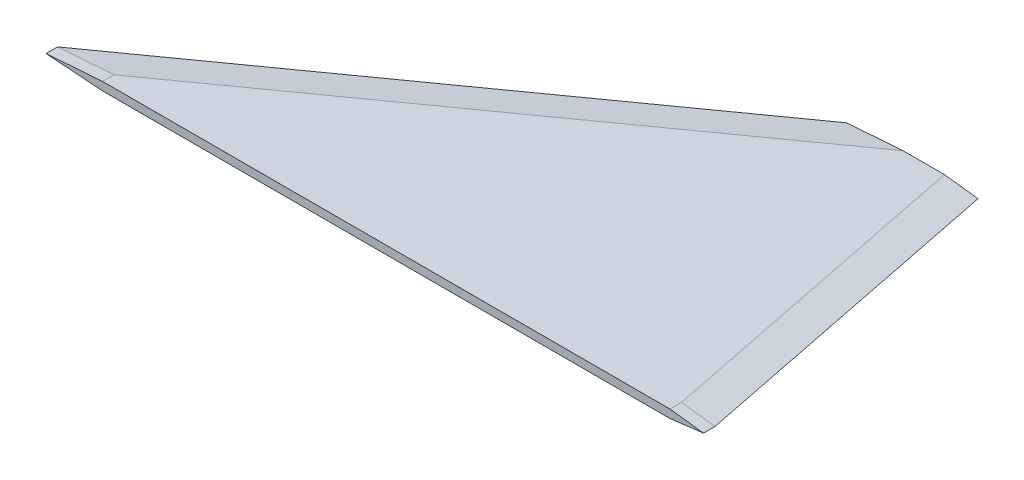
ISO-10303-21;
HEADER;
FILE_DESCRIPTION(('STEP AP214'),'2;1');
FILE_NAME('part.step','',(''),(''),'','','');
FILE_SCHEMA(('AUTOMOTIVE_DESIGN { 1 0 10303 214 1 1 1 1 }'));
ENDSEC;
DATA;
#1=APPLICATION_CONTEXT('core data for automotive mechanical design processes');
#2=APPLICATION_PROTOCOL_DEFINITION('international standard','automotive_design',2000,#1);
#3=PRODUCT_CONTEXT('',#1,'mechanical');
#4=PRODUCT('Part','Part','',(#3));
#5=PRODUCT_RELATED_PRODUCT_CATEGORY('part','',(#4));
#6=PRODUCT_DEFINITION_FORMATION('','',#4);
#7=PRODUCT_DEFINITION_CONTEXT('part definition',#1,'design');
#8=PRODUCT_DEFINITION('design','',#6,#7);
#9=PRODUCT_DEFINITION_SHAPE('','',#8);
#10=(LENGTH_UNIT() NAMED_UNIT(*) SI_UNIT(.MILLI.,.METRE.));
#11=(NAMED_UNIT(*) PLANE_ANGLE_UNIT() SI_UNIT($,.RADIAN.));
#12=(NAMED_UNIT(*) SI_UNIT($,.STERADIAN.) SOLID_ANGLE_UNIT());
#13=UNCERTAINTY_MEASURE_WITH_UNIT(LENGTH_MEASURE(1.E-05),#10,'distance_accuracy_value','');
#14=(GEOMETRIC_REPRESENTATION_CONTEXT(3) GLOBAL_UNCERTAINTY_ASSIGNED_CONTEXT((#13)) GLOBAL_UNIT_ASSIGNED_CONTEXT((#10,
#11,#12)) REPRESENTATION_CONTEXT('',''));
#15=CARTESIAN_POINT('',(0.,0.,0.));
#16=DIRECTION('',(0.,0.,1.));
#17=DIRECTION('',(1.,0.,0.));
#18=AXIS2_PLACEMENT_3D('',#15,#16,#17);
#19=CARTESIAN_POINT('',(50.8,1.5875,-127.));
#20=DIRECTION('',(0.,0.,1.));
#21=DIRECTION('',(1.,0.,0.));
#22=AXIS2_PLACEMENT_3D('',#19,#20,#21);
#23=PLANE('',#22);
#24=DIRECTION('',(-1.,0.,0.));
#25=VECTOR('',#24,1.);
#26=CARTESIAN_POINT('',(50.8,1.5875,-127.));
#27=LINE('',#26,#25);
#28=CARTESIAN_POINT('',(88.6484904354742,1.5875,-127.));
#29=VERTEX_POINT('',#28);
#30=CARTESIAN_POINT('',(72.6499061782882,1.5875,-127.));
#31=VERTEX_POINT('',#30);
#32=EDGE_CURVE('E135',#29,#31,#27,.T.);
#33=ORIENTED_EDGE('',*,*,#32,.F.);
#34=DIRECTION('',(-0.992571580398274,0.121662063872318,0.));
#35=VECTOR('',#34,1.);
#36=CARTESIAN_POINT('',(109.350975108138,-0.950057051100235,-127.));
#37=LINE('',#36,#35);
#38=CARTESIAN_POINT('',(101.6,0.,-127.));
#39=VERTEX_POINT('',#38);
#40=EDGE_CURVE('E159',#29,#39,#37,.F.);
#41=ORIENTED_EDGE('',*,*,#40,.T.);
#42=DIRECTION('',(-0.992571580398275,-0.121662063872315,0.));
#43=VECTOR('',#42,1.);
#44=CARTESIAN_POINT('',(101.6,0.,-127.));
#45=LINE('',#44,#43);
#46=CARTESIAN_POINT('',(88.6484904354738,-1.5875,-127.));
#47=VERTEX_POINT('',#46);
#48=EDGE_CURVE('E56',#39,#47,#45,.T.);
#49=ORIENTED_EDGE('',*,*,#48,.T.);
#50=DIRECTION('',(-1.,0.,0.));
#51=VECTOR('',#50,1.);
#52=CARTESIAN_POINT('',(50.8,-1.5875,-127.));
#53=LINE('',#52,#51);
#54=CARTESIAN_POINT('',(72.6499061782888,-1.5875,-127.));
#55=VERTEX_POINT('',#54);
#56=EDGE_CURVE('E138',#47,#55,#53,.T.);
#57=ORIENTED_EDGE('',*,*,#56,.T.);
#58=DIRECTION('',(-0.997371045454218,0.0724637681159402,0.));
#59=VECTOR('',#58,1.);
#60=CARTESIAN_POINT('',(-126.066372610796,12.8501863682431,-127.));
#61=LINE('',#60,#59);
#62=CARTESIAN_POINT('',(50.8,0.,-127.));
#63=VERTEX_POINT('',#62);
#64=EDGE_CURVE('E146',#55,#63,#61,.T.);
#65=ORIENTED_EDGE('',*,*,#64,.T.);
#66=DIRECTION('',(-0.997371045454218,-0.0724637681159421,0.));
#67=VECTOR('',#66,1.);
#68=CARTESIAN_POINT('',(-34.9556610922667,-6.23055819430701,-127.));
#69=LINE('',#68,#67);
#70=EDGE_CURVE('E148',#63,#31,#69,.F.);
#71=ORIENTED_EDGE('',*,*,#70,.T.);
#72=EDGE_LOOP('',(#33,#41,#49,#57,#65,#71));
#73=FACE_BOUND('',#72,.T.);
#74=ADVANCED_FACE('F34',(#73),#23,.F.);
#75=CARTESIAN_POINT('',(0.,1.5875,0.));
#76=DIRECTION('',(0.,-1.,0.));
#77=DIRECTION('',(0.,0.,-1.));
#78=AXIS2_PLACEMENT_3D('',#75,#76,#77);
#79=PLANE('',#78);
#80=DIRECTION('',(-0.813733471206735,0.,0.581238193719096));
#81=VECTOR('',#80,1.);
#82=CARTESIAN_POINT('',(-35.5236803451729,1.5875,-49.733152483242));
#83=LINE('',#82,#81);
#84=CARTESIAN_POINT('',(-105.150093821712,1.5875,0.));
#85=VERTEX_POINT('',#84);
#86=EDGE_CURVE('E137',#31,#85,#83,.T.);
#87=ORIENTED_EDGE('',*,*,#86,.T.);
#88=DIRECTION('',(0.,0.,-1.));
#89=VECTOR('',#88,1.);
#90=CARTESIAN_POINT('',(-105.150093821712,1.5875,4.445));
#91=LINE('',#90,#89);
#92=CARTESIAN_POINT('',(-105.150093821712,1.5875,4.445));
#93=VERTEX_POINT('',#92);
#94=EDGE_CURVE('E180',#93,#85,#91,.T.);
#95=ORIENTED_EDGE('',*,*,#94,.F.);
#96=DIRECTION('',(-1.,0.,0.));
#97=VECTOR('',#96,1.);
#98=CARTESIAN_POINT('',(114.048490435474,1.5875,4.445));
#99=LINE('',#98,#97);
#100=CARTESIAN_POINT('',(114.048490435474,1.5875,4.445));
#101=VERTEX_POINT('',#100);
#102=EDGE_CURVE('E179',#101,#93,#99,.T.);
#103=ORIENTED_EDGE('',*,*,#102,.F.);
#104=DIRECTION('',(0.,0.,-1.));
#105=VECTOR('',#104,1.);
#106=CARTESIAN_POINT('',(114.048490435474,1.5875,4.445));
#107=LINE('',#106,#105);
#108=CARTESIAN_POINT('',(114.048490435474,1.5875,0.));
#109=VERTEX_POINT('',#108);
#110=EDGE_CURVE('E171',#101,#109,#107,.T.);
#111=ORIENTED_EDGE('',*,*,#110,.T.);
#112=DIRECTION('',(-0.196116135138185,0.,-0.98058067569092));
#113=VECTOR('',#112,1.);
#114=CARTESIAN_POINT('',(109.66201003411,1.5875,-21.932402006822));
#115=LINE('',#114,#113);
#116=EDGE_CURVE('E153',#109,#29,#115,.T.);
#117=ORIENTED_EDGE('',*,*,#116,.T.);
#118=ORIENTED_EDGE('',*,*,#32,.T.);
#119=EDGE_LOOP('',(#87,#95,#103,#111,#117,#118));
#120=FACE_BOUND('',#119,.T.);
#121=ADVANCED_FACE('F176',(#120),#79,.F.);
#122=CARTESIAN_POINT('',(0.,-1.5875,0.));
#123=DIRECTION('',(0.,-1.,0.));
#124=DIRECTION('',(0.,0.,-1.));
#125=AXIS2_PLACEMENT_3D('',#122,#123,#124);
#126=PLANE('',#125);
#127=ORIENTED_EDGE('',*,*,#56,.F.);
#128=DIRECTION('',(0.196116135138185,0.,0.98058067569092));
#129=VECTOR('',#128,1.);
#130=CARTESIAN_POINT('',(114.546625418725,-1.5875,2.49067491625498));
#131=LINE('',#130,#129);
#132=CARTESIAN_POINT('',(114.048490435474,-1.5875,0.));
#133=VERTEX_POINT('',#132);
#134=EDGE_CURVE('E11',#47,#133,#131,.T.);
#135=ORIENTED_EDGE('',*,*,#134,.T.);
#136=DIRECTION('',(0.,0.,-1.));
#137=VECTOR('',#136,1.);
#138=CARTESIAN_POINT('',(114.048490435474,-1.5875,4.445));
#139=LINE('',#138,#137);
#140=CARTESIAN_POINT('',(114.048490435474,-1.5875,4.445));
#141=VERTEX_POINT('',#140);
#142=EDGE_CURVE('E113',#141,#133,#139,.T.);
#143=ORIENTED_EDGE('',*,*,#142,.F.);
#144=DIRECTION('',(1.,0.,0.));
#145=VECTOR('',#144,1.);
#146=CARTESIAN_POINT('',(-105.150093821711,-1.5875,4.445));
#147=LINE('',#146,#145);
#148=CARTESIAN_POINT('',(-105.150093821711,-1.5875,4.445));
#149=VERTEX_POINT('',#148);
#150=EDGE_CURVE('E105',#149,#141,#147,.T.);
#151=ORIENTED_EDGE('',*,*,#150,.F.);
#152=DIRECTION('',(0.,0.,-1.));
#153=VECTOR('',#152,1.);
#154=CARTESIAN_POINT('',(-105.150093821711,-1.5875,4.445));
#155=LINE('',#154,#153);
#156=CARTESIAN_POINT('',(-105.150093821711,-1.5875,0.));
#157=VERTEX_POINT('',#156);
#158=EDGE_CURVE('E110',#149,#157,#155,.T.);
#159=ORIENTED_EDGE('',*,*,#158,.T.);
#160=DIRECTION('',(0.813733471206735,0.,-0.581238193719096));
#161=VECTOR('',#160,1.);
#162=CARTESIAN_POINT('',(58.1817250602327,-1.5875,-116.665584915674));
#163=LINE('',#162,#161);
#164=EDGE_CURVE('E151',#157,#55,#163,.T.);
#165=ORIENTED_EDGE('',*,*,#164,.T.);
#166=EDGE_LOOP('',(#127,#135,#143,#151,#159,#165));
#167=FACE_BOUND('',#166,.T.);
#168=ADVANCED_FACE('F107',(#167),#126,.T.);
#169=CARTESIAN_POINT('',(-127.,0.,0.));
#170=DIRECTION('',(-0.0720937250910572,-0.992277876713668,-0.10093121512748));
#171=DIRECTION('',(0.813733471206735,0.,-0.581238193719096));
#172=AXIS2_PLACEMENT_3D('',#169,#170,#171);
#173=PLANE('',#172);
#174=DIRECTION('',(-0.813733471206735,0.,0.581238193719097));
#175=VECTOR('',#174,1.);
#176=CARTESIAN_POINT('',(-127.,0.,0.));
#177=LINE('',#176,#175);
#178=CARTESIAN_POINT('',(-127.,0.,0.));
#179=VERTEX_POINT('',#178);
#180=EDGE_CURVE('E130',#63,#179,#177,.T.);
#181=ORIENTED_EDGE('',*,*,#180,.F.);
#182=ORIENTED_EDGE('',*,*,#64,.F.);
#183=ORIENTED_EDGE('',*,*,#164,.F.);
#184=DIRECTION('',(0.997371045454218,-0.0724637681159402,0.));
#185=VECTOR('',#184,1.);
#186=CARTESIAN_POINT('',(-127.,0.,0.));
#187=LINE('',#186,#185);
#188=EDGE_CURVE('E128',#179,#157,#187,.T.);
#189=ORIENTED_EDGE('',*,*,#188,.F.);
#190=EDGE_LOOP('',(#181,#182,#183,#189));
#191=FACE_BOUND('',#190,.T.);
#192=ADVANCED_FACE('F199',(#191),#173,.T.);
#193=CARTESIAN_POINT('',(-35.5236803451729,1.5875,-49.7331524832421));
#194=DIRECTION('',(0.0720937250910591,-0.992277876713668,0.100931215127483));
#195=DIRECTION('',(-0.813733471206735,0.,0.581238193719096));
#196=AXIS2_PLACEMENT_3D('',#193,#194,#195);
#197=PLANE('',#196);
#198=ORIENTED_EDGE('',*,*,#70,.F.);
#199=ORIENTED_EDGE('',*,*,#180,.T.);
#200=DIRECTION('',(0.997371045454218,0.0724637681159421,0.));
#201=VECTOR('',#200,1.);
#202=CARTESIAN_POINT('',(-35.8892884814706,6.61962817393647,0.));
#203=LINE('',#202,#201);
#204=EDGE_CURVE('E143',#85,#179,#203,.F.);
#205=ORIENTED_EDGE('',*,*,#204,.F.);
#206=ORIENTED_EDGE('',*,*,#86,.F.);
#207=EDGE_LOOP('',(#198,#199,#205,#206));
#208=FACE_BOUND('',#207,.T.);
#209=ADVANCED_FACE('F201',(#208),#197,.F.);
#210=CARTESIAN_POINT('',(101.6,0.,-127.));
#211=DIRECTION('',(0.121626063852627,-0.992277876713668,-0.0243252127705254));
#212=DIRECTION('',(0.196116135138185,0.,0.98058067569092));
#213=AXIS2_PLACEMENT_3D('',#210,#211,#212);
#214=PLANE('',#213);
#215=DIRECTION('',(-0.196116135138185,0.,-0.98058067569092));
#216=VECTOR('',#215,1.);
#217=CARTESIAN_POINT('',(101.6,0.,-127.));
#218=LINE('',#217,#216);
#219=CARTESIAN_POINT('',(127.,0.,0.));
#220=VERTEX_POINT('',#219);
#221=EDGE_CURVE('E38',#220,#39,#218,.T.);
#222=ORIENTED_EDGE('',*,*,#221,.F.);
#223=DIRECTION('',(0.992571580398275,0.121662063872315,0.));
#224=VECTOR('',#223,1.);
#225=CARTESIAN_POINT('',(101.975962107756,-3.06726099811138,0.));
#226=LINE('',#225,#224);
#227=EDGE_CURVE('E161',#133,#220,#226,.T.);
#228=ORIENTED_EDGE('',*,*,#227,.F.);
#229=ORIENTED_EDGE('',*,*,#134,.F.);
#230=ORIENTED_EDGE('',*,*,#48,.F.);
#231=EDGE_LOOP('',(#222,#228,#229,#230));
#232=FACE_BOUND('',#231,.T.);
#233=ADVANCED_FACE('F36',(#232),#214,.T.);
#234=CARTESIAN_POINT('',(109.66201003411,1.5875,-21.932402006822));
#235=DIRECTION('',(-0.12162606385263,-0.992277876713668,0.024325212770526));
#236=DIRECTION('',(-0.196116135138185,0.,-0.98058067569092));
#237=AXIS2_PLACEMENT_3D('',#234,#235,#236);
#238=PLANE('',#237);
#239=DIRECTION('',(0.992571580398274,-0.121662063872318,0.));
#240=VECTOR('',#239,1.);
#241=CARTESIAN_POINT('',(109.726937215894,2.11720394701123,0.));
#242=LINE('',#241,#240);
#243=EDGE_CURVE('E43',#220,#109,#242,.F.);
#244=ORIENTED_EDGE('',*,*,#243,.F.);
#245=ORIENTED_EDGE('',*,*,#221,.T.);
#246=ORIENTED_EDGE('',*,*,#40,.F.);
#247=ORIENTED_EDGE('',*,*,#116,.F.);
#248=EDGE_LOOP('',(#244,#245,#246,#247));
#249=FACE_BOUND('',#248,.T.);
#250=ADVANCED_FACE('F223',(#249),#238,.F.);
#251=CARTESIAN_POINT('',(-127.,0.,4.445));
#252=DIRECTION('',(0.0724637681159403,0.997371045454218,0.));
#253=DIRECTION('',(-0.997371045454218,0.0724637681159403,0.));
#254=AXIS2_PLACEMENT_3D('',#251,#252,#253);
#255=PLANE('',#254);
#256=ORIENTED_EDGE('',*,*,#188,.T.);
#257=ORIENTED_EDGE('',*,*,#158,.F.);
#258=DIRECTION('',(0.997371045454218,-0.0724637681159403,0.));
#259=VECTOR('',#258,1.);
#260=CARTESIAN_POINT('',(-127.,0.,4.445));
#261=LINE('',#260,#259);
#262=CARTESIAN_POINT('',(-127.,0.,4.445));
#263=VERTEX_POINT('',#262);
#264=EDGE_CURVE('E117',#263,#149,#261,.T.);
#265=ORIENTED_EDGE('',*,*,#264,.F.);
#266=DIRECTION('',(0.,0.,-1.));
#267=VECTOR('',#266,1.);
#268=CARTESIAN_POINT('',(-127.,0.,4.445));
#269=LINE('',#268,#267);
#270=EDGE_CURVE('E183',#263,#179,#269,.T.);
#271=ORIENTED_EDGE('',*,*,#270,.T.);
#272=EDGE_LOOP('',(#256,#257,#265,#271));
#273=FACE_BOUND('',#272,.T.);
#274=ADVANCED_FACE('F127',(#273),#255,.F.);
#275=CARTESIAN_POINT('',(114.048490435474,-1.5875,4.445));
#276=DIRECTION('',(-0.121662063872315,0.992571580398275,0.));
#277=DIRECTION('',(-0.992571580398275,-0.121662063872315,0.));
#278=AXIS2_PLACEMENT_3D('',#275,#276,#277);
#279=PLANE('',#278);
#280=ORIENTED_EDGE('',*,*,#227,.T.);
#281=DIRECTION('',(0.,0.,-1.));
#282=VECTOR('',#281,1.);
#283=CARTESIAN_POINT('',(127.,0.,4.445));
#284=LINE('',#283,#282);
#285=CARTESIAN_POINT('',(127.,0.,4.445));
#286=VERTEX_POINT('',#285);
#287=EDGE_CURVE('E131',#286,#220,#284,.T.);
#288=ORIENTED_EDGE('',*,*,#287,.F.);
#289=DIRECTION('',(0.992571580398275,0.121662063872315,0.));
#290=VECTOR('',#289,1.);
#291=CARTESIAN_POINT('',(114.048490435474,-1.5875,4.445));
#292=LINE('',#291,#290);
#293=EDGE_CURVE('E116',#141,#286,#292,.T.);
#294=ORIENTED_EDGE('',*,*,#293,.F.);
#295=ORIENTED_EDGE('',*,*,#142,.T.);
#296=EDGE_LOOP('',(#280,#288,#294,#295));
#297=FACE_BOUND('',#296,.T.);
#298=ADVANCED_FACE('F192',(#297),#279,.F.);
#299=CARTESIAN_POINT('',(127.,0.,4.445));
#300=DIRECTION('',(-0.121662063872317,-0.992571580398274,0.));
#301=DIRECTION('',(0.992571580398275,-0.121662063872317,0.));
#302=AXIS2_PLACEMENT_3D('',#299,#300,#301);
#303=PLANE('',#302);
#304=ORIENTED_EDGE('',*,*,#243,.T.);
#305=ORIENTED_EDGE('',*,*,#110,.F.);
#306=DIRECTION('',(-0.992571580398274,0.121662063872317,0.));
#307=VECTOR('',#306,1.);
#308=CARTESIAN_POINT('',(127.,0.,4.445));
#309=LINE('',#308,#307);
#310=EDGE_CURVE('E189',#286,#101,#309,.T.);
#311=ORIENTED_EDGE('',*,*,#310,.F.);
#312=ORIENTED_EDGE('',*,*,#287,.T.);
#313=EDGE_LOOP('',(#304,#305,#311,#312));
#314=FACE_BOUND('',#313,.T.);
#315=ADVANCED_FACE('F169',(#314),#303,.F.);
#316=CARTESIAN_POINT('',(-105.150093821712,1.5875,4.445));
#317=DIRECTION('',(0.0724637681159419,-0.997371045454217,0.));
#318=DIRECTION('',(0.997371045454218,0.0724637681159419,0.));
#319=AXIS2_PLACEMENT_3D('',#316,#317,#318);
#320=PLANE('',#319);
#321=ORIENTED_EDGE('',*,*,#204,.T.);
#322=ORIENTED_EDGE('',*,*,#270,.F.);
#323=DIRECTION('',(-0.997371045454218,-0.0724637681159419,0.));
#324=VECTOR('',#323,1.);
#325=CARTESIAN_POINT('',(-105.150093821712,1.5875,4.445));
#326=LINE('',#325,#324);
#327=EDGE_CURVE('E122',#93,#263,#326,.T.);
#328=ORIENTED_EDGE('',*,*,#327,.F.);
#329=ORIENTED_EDGE('',*,*,#94,.T.);
#330=EDGE_LOOP('',(#321,#322,#328,#329));
#331=FACE_BOUND('',#330,.T.);
#332=ADVANCED_FACE('F203',(#331),#320,.F.);
#333=CARTESIAN_POINT('',(0.,0.,4.445));
#334=DIRECTION('',(0.,0.,1.));
#335=DIRECTION('',(1.,0.,0.));
#336=AXIS2_PLACEMENT_3D('',#333,#334,#335);
#337=PLANE('',#336);
#338=ORIENTED_EDGE('',*,*,#264,.T.);
#339=ORIENTED_EDGE('',*,*,#150,.T.);
#340=ORIENTED_EDGE('',*,*,#293,.T.);
#341=ORIENTED_EDGE('',*,*,#310,.T.);
#342=ORIENTED_EDGE('',*,*,#102,.T.);
#343=ORIENTED_EDGE('',*,*,#327,.T.);
#344=EDGE_LOOP('',(#338,#339,#340,#341,#342,#343));
#345=FACE_BOUND('',#344,.T.);
#346=ADVANCED_FACE('F120',(#345),#337,.T.);
#347=CLOSED_SHELL('',(#74,#121,#168,#192,#209,#233,#250,#274,#298,#315,#332,#346));
#348=MANIFOLD_SOLID_BREP('B2',#347);
#349=ADVANCED_BREP_SHAPE_REPRESENTATION('',(#18,#348),#14);
#350=SHAPE_DEFINITION_REPRESENTATION(#9,#349);
ENDSEC;
END-ISO-10303-21;
